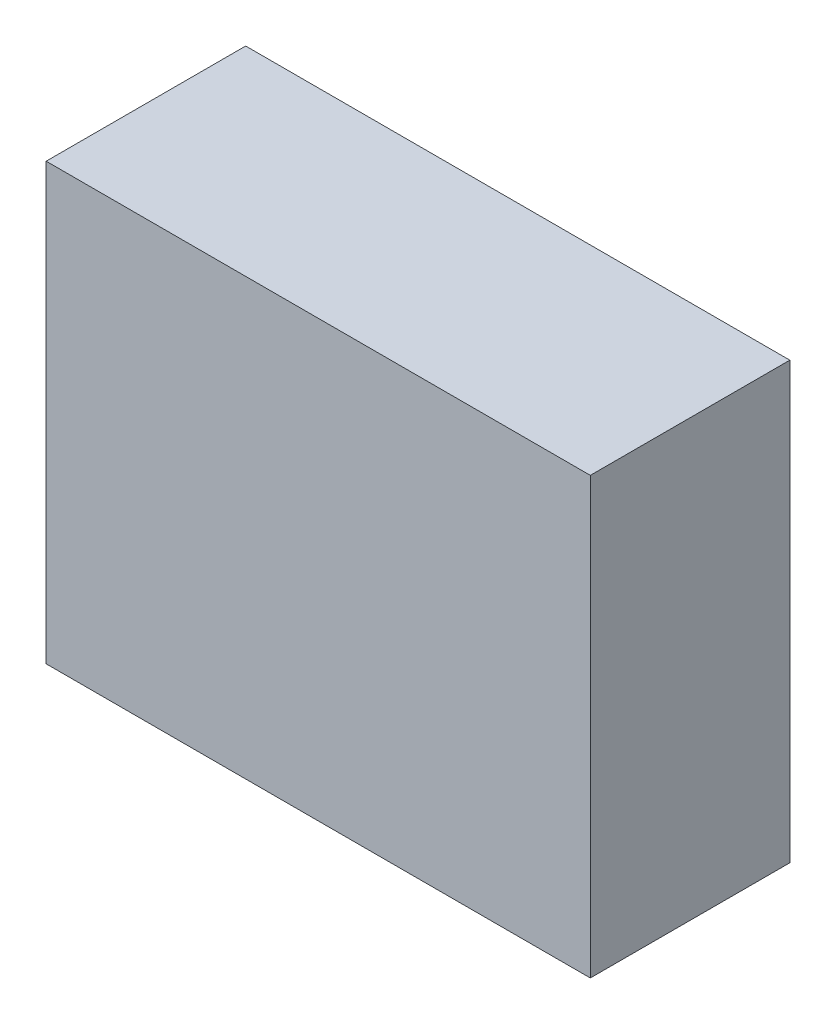
ISO-10303-21;
HEADER;
FILE_DESCRIPTION(('STEP AP214'),'2;1');
FILE_NAME('part.step','',(''),(''),'','','');
FILE_SCHEMA(('AUTOMOTIVE_DESIGN { 1 0 10303 214 1 1 1 1 }'));
ENDSEC;
DATA;
#1=APPLICATION_CONTEXT('core data for automotive mechanical design processes');
#2=APPLICATION_PROTOCOL_DEFINITION('international standard','automotive_design',2000,#1);
#3=PRODUCT_CONTEXT('',#1,'mechanical');
#4=PRODUCT('Part','Part','',(#3));
#5=PRODUCT_RELATED_PRODUCT_CATEGORY('part','',(#4));
#6=PRODUCT_DEFINITION_FORMATION('','',#4);
#7=PRODUCT_DEFINITION_CONTEXT('part definition',#1,'design');
#8=PRODUCT_DEFINITION('design','',#6,#7);
#9=PRODUCT_DEFINITION_SHAPE('','',#8);
#10=(LENGTH_UNIT() NAMED_UNIT(*) SI_UNIT(.MILLI.,.METRE.));
#11=(NAMED_UNIT(*) PLANE_ANGLE_UNIT() SI_UNIT($,.RADIAN.));
#12=(NAMED_UNIT(*) SI_UNIT($,.STERADIAN.) SOLID_ANGLE_UNIT());
#13=UNCERTAINTY_MEASURE_WITH_UNIT(LENGTH_MEASURE(1.E-05),#10,'distance_accuracy_value','');
#14=(GEOMETRIC_REPRESENTATION_CONTEXT(3) GLOBAL_UNCERTAINTY_ASSIGNED_CONTEXT((#13)) GLOBAL_UNIT_ASSIGNED_CONTEXT((#10,
#11,#12)) REPRESENTATION_CONTEXT('',''));
#15=CARTESIAN_POINT('',(0.,0.,0.));
#16=DIRECTION('',(0.,0.,1.));
#17=DIRECTION('',(1.,0.,0.));
#18=AXIS2_PLACEMENT_3D('',#15,#16,#17);
#19=CARTESIAN_POINT('',(-15.,-12.,11.));
#20=DIRECTION('',(1.,0.,0.));
#21=DIRECTION('',(0.,0.,-1.));
#22=AXIS2_PLACEMENT_3D('',#19,#20,#21);
#23=PLANE('',#22);
#24=DIRECTION('',(0.,-1.,0.));
#25=VECTOR('',#24,1.);
#26=CARTESIAN_POINT('',(-15.,-12.,0.));
#27=LINE('',#26,#25);
#28=CARTESIAN_POINT('',(-15.,12.,0.));
#29=VERTEX_POINT('',#28);
#30=CARTESIAN_POINT('',(-15.,-12.,0.));
#31=VERTEX_POINT('',#30);
#32=EDGE_CURVE('E102',#29,#31,#27,.T.);
#33=ORIENTED_EDGE('',*,*,#32,.T.);
#34=DIRECTION('',(0.,0.,-1.));
#35=VECTOR('',#34,1.);
#36=CARTESIAN_POINT('',(-15.,-12.,11.));
#37=LINE('',#36,#35);
#38=CARTESIAN_POINT('',(-15.,-12.,11.));
#39=VERTEX_POINT('',#38);
#40=EDGE_CURVE('E11',#39,#31,#37,.T.);
#41=ORIENTED_EDGE('',*,*,#40,.F.);
#42=DIRECTION('',(0.,-1.,0.));
#43=VECTOR('',#42,1.);
#44=CARTESIAN_POINT('',(-15.,-12.,11.));
#45=LINE('',#44,#43);
#46=CARTESIAN_POINT('',(-15.,12.,11.));
#47=VERTEX_POINT('',#46);
#48=EDGE_CURVE('E90',#47,#39,#45,.T.);
#49=ORIENTED_EDGE('',*,*,#48,.F.);
#50=DIRECTION('',(0.,0.,-1.));
#51=VECTOR('',#50,1.);
#52=CARTESIAN_POINT('',(-15.,12.,11.));
#53=LINE('',#52,#51);
#54=EDGE_CURVE('E98',#47,#29,#53,.T.);
#55=ORIENTED_EDGE('',*,*,#54,.T.);
#56=EDGE_LOOP('',(#33,#41,#49,#55));
#57=FACE_BOUND('',#56,.T.);
#58=ADVANCED_FACE('F39',(#57),#23,.F.);
#59=CARTESIAN_POINT('',(-15.,-12.,11.));
#60=DIRECTION('',(0.,1.,0.));
#61=DIRECTION('',(0.,0.,1.));
#62=AXIS2_PLACEMENT_3D('',#59,#60,#61);
#63=PLANE('',#62);
#64=DIRECTION('',(1.,0.,0.));
#65=VECTOR('',#64,1.);
#66=CARTESIAN_POINT('',(-15.,-12.,0.));
#67=LINE('',#66,#65);
#68=CARTESIAN_POINT('',(15.,-12.,0.));
#69=VERTEX_POINT('',#68);
#70=EDGE_CURVE('E94',#31,#69,#67,.T.);
#71=ORIENTED_EDGE('',*,*,#70,.T.);
#72=DIRECTION('',(0.,0.,-1.));
#73=VECTOR('',#72,1.);
#74=CARTESIAN_POINT('',(15.,-12.,11.));
#75=LINE('',#74,#73);
#76=CARTESIAN_POINT('',(15.,-12.,11.));
#77=VERTEX_POINT('',#76);
#78=EDGE_CURVE('E47',#77,#69,#75,.T.);
#79=ORIENTED_EDGE('',*,*,#78,.F.);
#80=DIRECTION('',(1.,0.,0.));
#81=VECTOR('',#80,1.);
#82=CARTESIAN_POINT('',(-15.,-12.,11.));
#83=LINE('',#82,#81);
#84=EDGE_CURVE('E85',#39,#77,#83,.T.);
#85=ORIENTED_EDGE('',*,*,#84,.F.);
#86=ORIENTED_EDGE('',*,*,#40,.T.);
#87=EDGE_LOOP('',(#71,#79,#85,#86));
#88=FACE_BOUND('',#87,.T.);
#89=ADVANCED_FACE('F93',(#88),#63,.F.);
#90=CARTESIAN_POINT('',(15.,-12.,11.));
#91=DIRECTION('',(-1.,0.,0.));
#92=DIRECTION('',(0.,0.,1.));
#93=AXIS2_PLACEMENT_3D('',#90,#91,#92);
#94=PLANE('',#93);
#95=DIRECTION('',(0.,1.,0.));
#96=VECTOR('',#95,1.);
#97=CARTESIAN_POINT('',(15.,-12.,0.));
#98=LINE('',#97,#96);
#99=CARTESIAN_POINT('',(15.,12.,0.));
#100=VERTEX_POINT('',#99);
#101=EDGE_CURVE('E72',#69,#100,#98,.T.);
#102=ORIENTED_EDGE('',*,*,#101,.T.);
#103=DIRECTION('',(0.,0.,-1.));
#104=VECTOR('',#103,1.);
#105=CARTESIAN_POINT('',(15.,12.,11.));
#106=LINE('',#105,#104);
#107=CARTESIAN_POINT('',(15.,12.,11.));
#108=VERTEX_POINT('',#107);
#109=EDGE_CURVE('E95',#108,#100,#106,.T.);
#110=ORIENTED_EDGE('',*,*,#109,.F.);
#111=DIRECTION('',(0.,1.,0.));
#112=VECTOR('',#111,1.);
#113=CARTESIAN_POINT('',(15.,-12.,11.));
#114=LINE('',#113,#112);
#115=EDGE_CURVE('E88',#77,#108,#114,.T.);
#116=ORIENTED_EDGE('',*,*,#115,.F.);
#117=ORIENTED_EDGE('',*,*,#78,.T.);
#118=EDGE_LOOP('',(#102,#110,#116,#117));
#119=FACE_BOUND('',#118,.T.);
#120=ADVANCED_FACE('F96',(#119),#94,.F.);
#121=CARTESIAN_POINT('',(-15.,12.,11.));
#122=DIRECTION('',(0.,-1.,0.));
#123=DIRECTION('',(0.,0.,-1.));
#124=AXIS2_PLACEMENT_3D('',#121,#122,#123);
#125=PLANE('',#124);
#126=DIRECTION('',(-1.,0.,0.));
#127=VECTOR('',#126,1.);
#128=CARTESIAN_POINT('',(-15.,12.,0.));
#129=LINE('',#128,#127);
#130=EDGE_CURVE('E78',#100,#29,#129,.T.);
#131=ORIENTED_EDGE('',*,*,#130,.T.);
#132=ORIENTED_EDGE('',*,*,#54,.F.);
#133=DIRECTION('',(-1.,0.,0.));
#134=VECTOR('',#133,1.);
#135=CARTESIAN_POINT('',(-15.,12.,11.));
#136=LINE('',#135,#134);
#137=EDGE_CURVE('E55',#108,#47,#136,.T.);
#138=ORIENTED_EDGE('',*,*,#137,.F.);
#139=ORIENTED_EDGE('',*,*,#109,.T.);
#140=EDGE_LOOP('',(#131,#132,#138,#139));
#141=FACE_BOUND('',#140,.T.);
#142=ADVANCED_FACE('F109',(#141),#125,.F.);
#143=CARTESIAN_POINT('',(0.,0.,11.));
#144=DIRECTION('',(0.,0.,-1.));
#145=DIRECTION('',(-1.,0.,0.));
#146=AXIS2_PLACEMENT_3D('',#143,#144,#145);
#147=PLANE('',#146);
#148=ORIENTED_EDGE('',*,*,#48,.T.);
#149=ORIENTED_EDGE('',*,*,#84,.T.);
#150=ORIENTED_EDGE('',*,*,#115,.T.);
#151=ORIENTED_EDGE('',*,*,#137,.T.);
#152=EDGE_LOOP('',(#148,#149,#150,#151));
#153=FACE_BOUND('',#152,.T.);
#154=ADVANCED_FACE('F86',(#153),#147,.F.);
#155=CARTESIAN_POINT('',(0.,0.,0.));
#156=DIRECTION('',(0.,0.,-1.));
#157=DIRECTION('',(-1.,0.,0.));
#158=AXIS2_PLACEMENT_3D('',#155,#156,#157);
#159=PLANE('',#158);
#160=ORIENTED_EDGE('',*,*,#32,.F.);
#161=ORIENTED_EDGE('',*,*,#130,.F.);
#162=ORIENTED_EDGE('',*,*,#101,.F.);
#163=ORIENTED_EDGE('',*,*,#70,.F.);
#164=EDGE_LOOP('',(#160,#161,#162,#163));
#165=FACE_BOUND('',#164,.T.);
#166=ADVANCED_FACE('F112',(#165),#159,.T.);
#167=CLOSED_SHELL('',(#58,#89,#120,#142,#154,#166));
#168=MANIFOLD_SOLID_BREP('B2',#167);
#169=ADVANCED_BREP_SHAPE_REPRESENTATION('',(#18,#168),#14);
#170=SHAPE_DEFINITION_REPRESENTATION(#9,#169);
ENDSEC;
END-ISO-10303-21;
